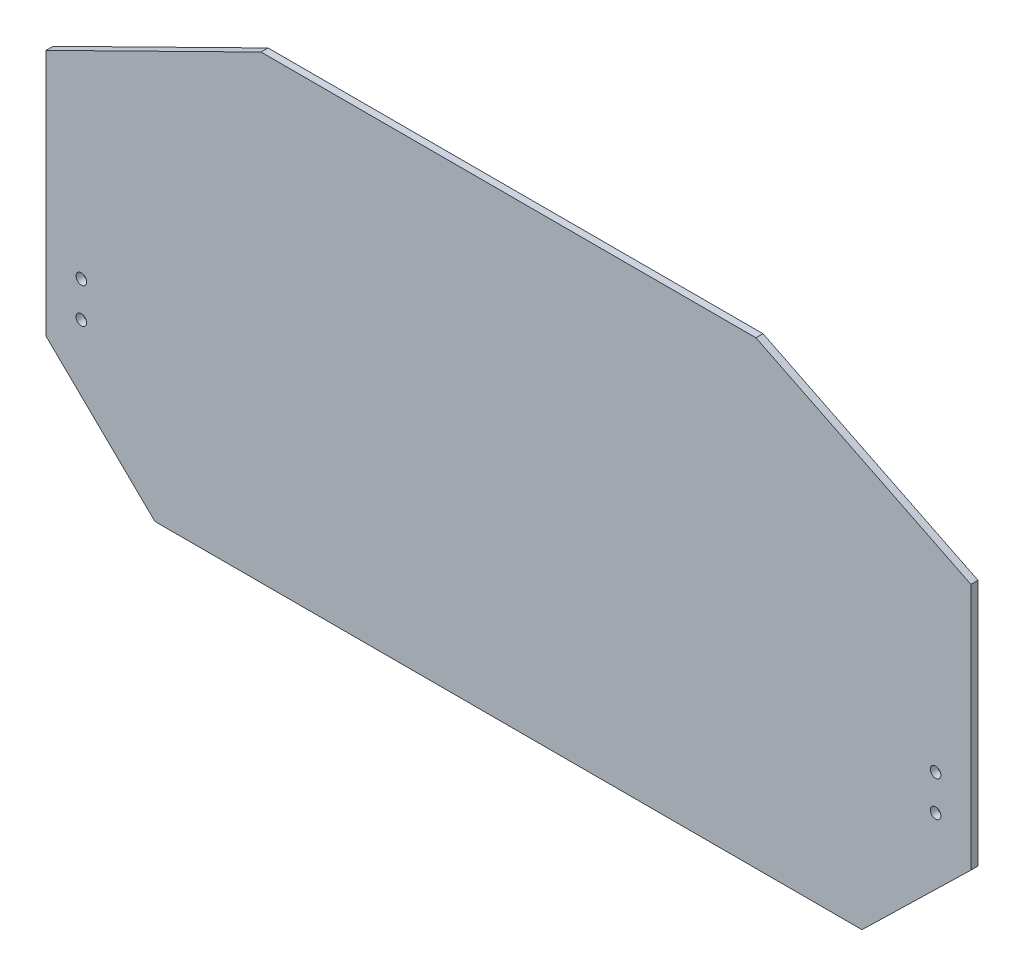
ISO-10303-21;
HEADER;
FILE_DESCRIPTION(('STEP AP214'),'2;1');
FILE_NAME('part.step','',(''),(''),'','','');
FILE_SCHEMA(('AUTOMOTIVE_DESIGN { 1 0 10303 214 1 1 1 1 }'));
ENDSEC;
DATA;
#1=APPLICATION_CONTEXT('core data for automotive mechanical design processes');
#2=APPLICATION_PROTOCOL_DEFINITION('international standard','automotive_design',2000,#1);
#3=PRODUCT_CONTEXT('',#1,'mechanical');
#4=PRODUCT('Part','Part','',(#3));
#5=PRODUCT_RELATED_PRODUCT_CATEGORY('part','',(#4));
#6=PRODUCT_DEFINITION_FORMATION('','',#4);
#7=PRODUCT_DEFINITION_CONTEXT('part definition',#1,'design');
#8=PRODUCT_DEFINITION('design','',#6,#7);
#9=PRODUCT_DEFINITION_SHAPE('','',#8);
#10=(LENGTH_UNIT() NAMED_UNIT(*) SI_UNIT(.MILLI.,.METRE.));
#11=(NAMED_UNIT(*) PLANE_ANGLE_UNIT() SI_UNIT($,.RADIAN.));
#12=(NAMED_UNIT(*) SI_UNIT($,.STERADIAN.) SOLID_ANGLE_UNIT());
#13=UNCERTAINTY_MEASURE_WITH_UNIT(LENGTH_MEASURE(1.E-05),#10,'distance_accuracy_value','');
#14=(GEOMETRIC_REPRESENTATION_CONTEXT(3) GLOBAL_UNCERTAINTY_ASSIGNED_CONTEXT((#13)) GLOBAL_UNIT_ASSIGNED_CONTEXT((#10,
#11,#12)) REPRESENTATION_CONTEXT('',''));
#15=CARTESIAN_POINT('',(0.,0.,0.));
#16=DIRECTION('',(0.,0.,1.));
#17=DIRECTION('',(1.,0.,0.));
#18=AXIS2_PLACEMENT_3D('',#15,#16,#17);
#19=CARTESIAN_POINT('',(0.,0.,2.));
#20=DIRECTION('',(0.,0.,-1.));
#21=DIRECTION('',(-1.,0.,0.));
#22=AXIS2_PLACEMENT_3D('',#19,#20,#21);
#23=PLANE('',#22);
#24=DIRECTION('',(0.716515814452554,-0.697570847756264,0.));
#25=VECTOR('',#24,1.);
#26=CARTESIAN_POINT('',(-130.814754519511,0.,2.));
#27=LINE('',#26,#25);
#28=CARTESIAN_POINT('',(-130.814754519511,0.,2.));
#29=VERTEX_POINT('',#28);
#30=CARTESIAN_POINT('',(-100.,-30.,2.));
#31=VERTEX_POINT('',#30);
#32=EDGE_CURVE('E153',#29,#31,#27,.T.);
#33=ORIENTED_EDGE('',*,*,#32,.T.);
#34=DIRECTION('',(1.,0.,0.));
#35=VECTOR('',#34,1.);
#36=CARTESIAN_POINT('',(-100.,-30.,2.));
#37=LINE('',#36,#35);
#38=CARTESIAN_POINT('',(100.,-30.,2.));
#39=VERTEX_POINT('',#38);
#40=EDGE_CURVE('E101',#31,#39,#37,.T.);
#41=ORIENTED_EDGE('',*,*,#40,.T.);
#42=DIRECTION('',(0.716515814452555,0.697570847756263,0.));
#43=VECTOR('',#42,1.);
#44=CARTESIAN_POINT('',(130.814754519511,0.,2.));
#45=LINE('',#44,#43);
#46=CARTESIAN_POINT('',(130.814754519511,0.,2.));
#47=VERTEX_POINT('',#46);
#48=EDGE_CURVE('E168',#39,#47,#45,.T.);
#49=ORIENTED_EDGE('',*,*,#48,.T.);
#50=DIRECTION('',(0.,1.,0.));
#51=VECTOR('',#50,1.);
#52=CARTESIAN_POINT('',(130.814754519511,0.,2.));
#53=LINE('',#52,#51);
#54=CARTESIAN_POINT('',(130.814754519511,70.,2.));
#55=VERTEX_POINT('',#54);
#56=EDGE_CURVE('E181',#47,#55,#53,.T.);
#57=ORIENTED_EDGE('',*,*,#56,.T.);
#58=DIRECTION('',(-0.896817268026416,0.442401161582601,0.));
#59=VECTOR('',#58,1.);
#60=CARTESIAN_POINT('',(130.814754519511,70.,2.));
#61=LINE('',#60,#59);
#62=CARTESIAN_POINT('',(70.,100.,2.));
#63=VERTEX_POINT('',#62);
#64=EDGE_CURVE('E120',#55,#63,#61,.T.);
#65=ORIENTED_EDGE('',*,*,#64,.T.);
#66=DIRECTION('',(-1.,0.,0.));
#67=VECTOR('',#66,1.);
#68=CARTESIAN_POINT('',(-70.,100.,2.));
#69=LINE('',#68,#67);
#70=CARTESIAN_POINT('',(-70.,100.,2.));
#71=VERTEX_POINT('',#70);
#72=EDGE_CURVE('E114',#63,#71,#69,.T.);
#73=ORIENTED_EDGE('',*,*,#72,.T.);
#74=DIRECTION('',(-0.896817268026416,-0.442401161582601,0.));
#75=VECTOR('',#74,1.);
#76=CARTESIAN_POINT('',(-130.814754519511,70.,2.));
#77=LINE('',#76,#75);
#78=CARTESIAN_POINT('',(-130.814754519511,70.,2.));
#79=VERTEX_POINT('',#78);
#80=EDGE_CURVE('E118',#71,#79,#77,.T.);
#81=ORIENTED_EDGE('',*,*,#80,.T.);
#82=DIRECTION('',(0.,-1.,0.));
#83=VECTOR('',#82,1.);
#84=CARTESIAN_POINT('',(-130.814754519511,0.,2.));
#85=LINE('',#84,#83);
#86=EDGE_CURVE('E58',#79,#29,#85,.T.);
#87=ORIENTED_EDGE('',*,*,#86,.T.);
#88=EDGE_LOOP('',(#33,#41,#49,#57,#65,#73,#81,#87));
#89=FACE_BOUND('',#88,.T.);
#90=CARTESIAN_POINT('',(-120.814754519511,9.,2.));
#91=DIRECTION('',(0.,0.,1.));
#92=DIRECTION('',(1.,0.,0.));
#93=AXIS2_PLACEMENT_3D('',#90,#91,#92);
#94=CIRCLE('',#93,1.5);
#95=CARTESIAN_POINT('',(-119.314754519511,9.,2.));
#96=VERTEX_POINT('',#95);
#97=EDGE_CURVE('E142',#96,#96,#94,.T.);
#98=ORIENTED_EDGE('',*,*,#97,.F.);
#99=EDGE_LOOP('',(#98));
#100=FACE_BOUND('',#99,.T.);
#101=CARTESIAN_POINT('',(-120.814754519511,19.,2.));
#102=DIRECTION('',(0.,0.,1.));
#103=DIRECTION('',(1.,0.,0.));
#104=AXIS2_PLACEMENT_3D('',#101,#102,#103);
#105=CIRCLE('',#104,1.5);
#106=CARTESIAN_POINT('',(-119.314754519511,19.,2.));
#107=VERTEX_POINT('',#106);
#108=EDGE_CURVE('E190',#107,#107,#105,.T.);
#109=ORIENTED_EDGE('',*,*,#108,.F.);
#110=EDGE_LOOP('',(#109));
#111=FACE_BOUND('',#110,.T.);
#112=CARTESIAN_POINT('',(120.814754519511,19.,2.));
#113=DIRECTION('',(0.,0.,1.));
#114=DIRECTION('',(-1.,0.,0.));
#115=AXIS2_PLACEMENT_3D('',#112,#113,#114);
#116=CIRCLE('',#115,1.5);
#117=CARTESIAN_POINT('',(119.314754519511,19.,2.));
#118=VERTEX_POINT('',#117);
#119=EDGE_CURVE('E196',#118,#118,#116,.T.);
#120=ORIENTED_EDGE('',*,*,#119,.F.);
#121=EDGE_LOOP('',(#120));
#122=FACE_BOUND('',#121,.T.);
#123=CARTESIAN_POINT('',(120.814754519511,9.,2.));
#124=DIRECTION('',(0.,0.,1.));
#125=DIRECTION('',(-1.,0.,0.));
#126=AXIS2_PLACEMENT_3D('',#123,#124,#125);
#127=CIRCLE('',#126,1.5);
#128=CARTESIAN_POINT('',(119.314754519511,9.,2.));
#129=VERTEX_POINT('',#128);
#130=EDGE_CURVE('E202',#129,#129,#127,.T.);
#131=ORIENTED_EDGE('',*,*,#130,.F.);
#132=EDGE_LOOP('',(#131));
#133=FACE_BOUND('',#132,.T.);
#134=ADVANCED_FACE('F41',(#89,#100,#111,#122,#133),#23,.F.);
#135=CARTESIAN_POINT('',(0.,0.,0.));
#136=DIRECTION('',(0.,0.,-1.));
#137=DIRECTION('',(-1.,0.,0.));
#138=AXIS2_PLACEMENT_3D('',#135,#136,#137);
#139=PLANE('',#138);
#140=CARTESIAN_POINT('',(120.814754519511,19.,0.));
#141=DIRECTION('',(0.,0.,1.));
#142=DIRECTION('',(-1.,0.,0.));
#143=AXIS2_PLACEMENT_3D('',#140,#141,#142);
#144=CIRCLE('',#143,1.5);
#145=CARTESIAN_POINT('',(119.314754519511,19.,0.));
#146=VERTEX_POINT('',#145);
#147=EDGE_CURVE('E199',#146,#146,#144,.T.);
#148=ORIENTED_EDGE('',*,*,#147,.T.);
#149=EDGE_LOOP('',(#148));
#150=FACE_BOUND('',#149,.T.);
#151=CARTESIAN_POINT('',(-120.814754519511,9.,0.));
#152=DIRECTION('',(0.,0.,1.));
#153=DIRECTION('',(1.,0.,0.));
#154=AXIS2_PLACEMENT_3D('',#151,#152,#153);
#155=CIRCLE('',#154,1.5);
#156=CARTESIAN_POINT('',(-119.314754519511,9.,0.));
#157=VERTEX_POINT('',#156);
#158=EDGE_CURVE('E187',#157,#157,#155,.T.);
#159=ORIENTED_EDGE('',*,*,#158,.T.);
#160=EDGE_LOOP('',(#159));
#161=FACE_BOUND('',#160,.T.);
#162=DIRECTION('',(0.716515814452554,-0.697570847756264,0.));
#163=VECTOR('',#162,1.);
#164=CARTESIAN_POINT('',(-130.814754519511,0.,0.));
#165=LINE('',#164,#163);
#166=CARTESIAN_POINT('',(-130.814754519511,0.,0.));
#167=VERTEX_POINT('',#166);
#168=CARTESIAN_POINT('',(-100.,-30.,0.));
#169=VERTEX_POINT('',#168);
#170=EDGE_CURVE('E138',#167,#169,#165,.T.);
#171=ORIENTED_EDGE('',*,*,#170,.F.);
#172=DIRECTION('',(0.,-1.,0.));
#173=VECTOR('',#172,1.);
#174=CARTESIAN_POINT('',(-130.814754519511,0.,0.));
#175=LINE('',#174,#173);
#176=CARTESIAN_POINT('',(-130.814754519511,70.,0.));
#177=VERTEX_POINT('',#176);
#178=EDGE_CURVE('E93',#177,#167,#175,.T.);
#179=ORIENTED_EDGE('',*,*,#178,.F.);
#180=DIRECTION('',(-0.896817268026416,-0.442401161582601,0.));
#181=VECTOR('',#180,1.);
#182=CARTESIAN_POINT('',(-130.814754519511,70.,0.));
#183=LINE('',#182,#181);
#184=CARTESIAN_POINT('',(-70.,100.,0.));
#185=VERTEX_POINT('',#184);
#186=EDGE_CURVE('E87',#185,#177,#183,.T.);
#187=ORIENTED_EDGE('',*,*,#186,.F.);
#188=DIRECTION('',(-1.,0.,0.));
#189=VECTOR('',#188,1.);
#190=CARTESIAN_POINT('',(-70.,100.,0.));
#191=LINE('',#190,#189);
#192=CARTESIAN_POINT('',(70.,100.,0.));
#193=VERTEX_POINT('',#192);
#194=EDGE_CURVE('E128',#193,#185,#191,.T.);
#195=ORIENTED_EDGE('',*,*,#194,.F.);
#196=DIRECTION('',(-0.896817268026416,0.442401161582601,0.));
#197=VECTOR('',#196,1.);
#198=CARTESIAN_POINT('',(130.814754519511,70.,0.));
#199=LINE('',#198,#197);
#200=CARTESIAN_POINT('',(130.814754519511,70.,0.));
#201=VERTEX_POINT('',#200);
#202=EDGE_CURVE('E148',#201,#193,#199,.T.);
#203=ORIENTED_EDGE('',*,*,#202,.F.);
#204=DIRECTION('',(0.,1.,0.));
#205=VECTOR('',#204,1.);
#206=CARTESIAN_POINT('',(130.814754519511,0.,0.));
#207=LINE('',#206,#205);
#208=CARTESIAN_POINT('',(130.814754519511,0.,0.));
#209=VERTEX_POINT('',#208);
#210=EDGE_CURVE('E146',#209,#201,#207,.T.);
#211=ORIENTED_EDGE('',*,*,#210,.F.);
#212=DIRECTION('',(0.716515814452555,0.697570847756263,0.));
#213=VECTOR('',#212,1.);
#214=CARTESIAN_POINT('',(130.814754519511,0.,0.));
#215=LINE('',#214,#213);
#216=CARTESIAN_POINT('',(100.,-30.,0.));
#217=VERTEX_POINT('',#216);
#218=EDGE_CURVE('E144',#217,#209,#215,.T.);
#219=ORIENTED_EDGE('',*,*,#218,.F.);
#220=DIRECTION('',(1.,0.,0.));
#221=VECTOR('',#220,1.);
#222=CARTESIAN_POINT('',(-100.,-30.,0.));
#223=LINE('',#222,#221);
#224=EDGE_CURVE('E141',#169,#217,#223,.T.);
#225=ORIENTED_EDGE('',*,*,#224,.F.);
#226=EDGE_LOOP('',(#171,#179,#187,#195,#203,#211,#219,#225));
#227=FACE_BOUND('',#226,.T.);
#228=CARTESIAN_POINT('',(-120.814754519511,19.,0.));
#229=DIRECTION('',(0.,0.,1.));
#230=DIRECTION('',(1.,0.,0.));
#231=AXIS2_PLACEMENT_3D('',#228,#229,#230);
#232=CIRCLE('',#231,1.5);
#233=CARTESIAN_POINT('',(-119.314754519511,19.,0.));
#234=VERTEX_POINT('',#233);
#235=EDGE_CURVE('E193',#234,#234,#232,.T.);
#236=ORIENTED_EDGE('',*,*,#235,.T.);
#237=EDGE_LOOP('',(#236));
#238=FACE_BOUND('',#237,.T.);
#239=CARTESIAN_POINT('',(120.814754519511,9.,0.));
#240=DIRECTION('',(0.,0.,1.));
#241=DIRECTION('',(-1.,0.,0.));
#242=AXIS2_PLACEMENT_3D('',#239,#240,#241);
#243=CIRCLE('',#242,1.5);
#244=CARTESIAN_POINT('',(119.314754519511,9.,0.));
#245=VERTEX_POINT('',#244);
#246=EDGE_CURVE('E205',#245,#245,#243,.T.);
#247=ORIENTED_EDGE('',*,*,#246,.T.);
#248=EDGE_LOOP('',(#247));
#249=FACE_BOUND('',#248,.T.);
#250=ADVANCED_FACE('F172',(#150,#161,#227,#238,#249),#139,.T.);
#251=CARTESIAN_POINT('',(-130.814754519511,0.,2.));
#252=DIRECTION('',(0.697570847756264,0.716515814452554,0.));
#253=DIRECTION('',(-0.716515814452554,0.697570847756264,0.));
#254=AXIS2_PLACEMENT_3D('',#251,#252,#253);
#255=PLANE('',#254);
#256=ORIENTED_EDGE('',*,*,#170,.T.);
#257=DIRECTION('',(0.,0.,-1.));
#258=VECTOR('',#257,1.);
#259=CARTESIAN_POINT('',(-100.,-30.,2.));
#260=LINE('',#259,#258);
#261=EDGE_CURVE('E11',#31,#169,#260,.T.);
#262=ORIENTED_EDGE('',*,*,#261,.F.);
#263=ORIENTED_EDGE('',*,*,#32,.F.);
#264=DIRECTION('',(0.,0.,-1.));
#265=VECTOR('',#264,1.);
#266=CARTESIAN_POINT('',(-130.814754519511,0.,2.));
#267=LINE('',#266,#265);
#268=EDGE_CURVE('E134',#29,#167,#267,.T.);
#269=ORIENTED_EDGE('',*,*,#268,.T.);
#270=EDGE_LOOP('',(#256,#262,#263,#269));
#271=FACE_BOUND('',#270,.T.);
#272=ADVANCED_FACE('F43',(#271),#255,.F.);
#273=CARTESIAN_POINT('',(-100.,-30.,2.));
#274=DIRECTION('',(0.,1.,0.));
#275=DIRECTION('',(0.,0.,1.));
#276=AXIS2_PLACEMENT_3D('',#273,#274,#275);
#277=PLANE('',#276);
#278=ORIENTED_EDGE('',*,*,#224,.T.);
#279=DIRECTION('',(0.,0.,-1.));
#280=VECTOR('',#279,1.);
#281=CARTESIAN_POINT('',(100.,-30.,2.));
#282=LINE('',#281,#280);
#283=EDGE_CURVE('E50',#39,#217,#282,.T.);
#284=ORIENTED_EDGE('',*,*,#283,.F.);
#285=ORIENTED_EDGE('',*,*,#40,.F.);
#286=ORIENTED_EDGE('',*,*,#261,.T.);
#287=EDGE_LOOP('',(#278,#284,#285,#286));
#288=FACE_BOUND('',#287,.T.);
#289=ADVANCED_FACE('F237',(#288),#277,.F.);
#290=CARTESIAN_POINT('',(130.814754519511,0.,2.));
#291=DIRECTION('',(-0.697570847756263,0.716515814452555,0.));
#292=DIRECTION('',(-0.716515814452555,-0.697570847756263,0.));
#293=AXIS2_PLACEMENT_3D('',#290,#291,#292);
#294=PLANE('',#293);
#295=ORIENTED_EDGE('',*,*,#218,.T.);
#296=DIRECTION('',(0.,0.,-1.));
#297=VECTOR('',#296,1.);
#298=CARTESIAN_POINT('',(130.814754519511,0.,2.));
#299=LINE('',#298,#297);
#300=EDGE_CURVE('E160',#47,#209,#299,.T.);
#301=ORIENTED_EDGE('',*,*,#300,.F.);
#302=ORIENTED_EDGE('',*,*,#48,.F.);
#303=ORIENTED_EDGE('',*,*,#283,.T.);
#304=EDGE_LOOP('',(#295,#301,#302,#303));
#305=FACE_BOUND('',#304,.T.);
#306=ADVANCED_FACE('F166',(#305),#294,.F.);
#307=CARTESIAN_POINT('',(130.814754519511,0.,2.));
#308=DIRECTION('',(-1.,0.,0.));
#309=DIRECTION('',(0.,0.,1.));
#310=AXIS2_PLACEMENT_3D('',#307,#308,#309);
#311=PLANE('',#310);
#312=ORIENTED_EDGE('',*,*,#210,.T.);
#313=DIRECTION('',(0.,0.,-1.));
#314=VECTOR('',#313,1.);
#315=CARTESIAN_POINT('',(130.814754519511,70.,2.));
#316=LINE('',#315,#314);
#317=EDGE_CURVE('E157',#55,#201,#316,.T.);
#318=ORIENTED_EDGE('',*,*,#317,.F.);
#319=ORIENTED_EDGE('',*,*,#56,.F.);
#320=ORIENTED_EDGE('',*,*,#300,.T.);
#321=EDGE_LOOP('',(#312,#318,#319,#320));
#322=FACE_BOUND('',#321,.T.);
#323=ADVANCED_FACE('F177',(#322),#311,.F.);
#324=CARTESIAN_POINT('',(130.814754519511,70.,2.));
#325=DIRECTION('',(-0.442401161582601,-0.896817268026417,0.));
#326=DIRECTION('',(0.896817268026417,-0.442401161582601,0.));
#327=AXIS2_PLACEMENT_3D('',#324,#325,#326);
#328=PLANE('',#327);
#329=ORIENTED_EDGE('',*,*,#202,.T.);
#330=DIRECTION('',(0.,0.,-1.));
#331=VECTOR('',#330,1.);
#332=CARTESIAN_POINT('',(70.,100.,2.));
#333=LINE('',#332,#331);
#334=EDGE_CURVE('E129',#63,#193,#333,.T.);
#335=ORIENTED_EDGE('',*,*,#334,.F.);
#336=ORIENTED_EDGE('',*,*,#64,.F.);
#337=ORIENTED_EDGE('',*,*,#317,.T.);
#338=EDGE_LOOP('',(#329,#335,#336,#337));
#339=FACE_BOUND('',#338,.T.);
#340=ADVANCED_FACE('F180',(#339),#328,.F.);
#341=CARTESIAN_POINT('',(-70.,100.,2.));
#342=DIRECTION('',(0.,-1.,0.));
#343=DIRECTION('',(0.,0.,-1.));
#344=AXIS2_PLACEMENT_3D('',#341,#342,#343);
#345=PLANE('',#344);
#346=ORIENTED_EDGE('',*,*,#194,.T.);
#347=DIRECTION('',(0.,0.,-1.));
#348=VECTOR('',#347,1.);
#349=CARTESIAN_POINT('',(-70.,100.,2.));
#350=LINE('',#349,#348);
#351=EDGE_CURVE('E125',#71,#185,#350,.T.);
#352=ORIENTED_EDGE('',*,*,#351,.F.);
#353=ORIENTED_EDGE('',*,*,#72,.F.);
#354=ORIENTED_EDGE('',*,*,#334,.T.);
#355=EDGE_LOOP('',(#346,#352,#353,#354));
#356=FACE_BOUND('',#355,.T.);
#357=ADVANCED_FACE('F126',(#356),#345,.F.);
#358=CARTESIAN_POINT('',(-130.814754519511,70.,2.));
#359=DIRECTION('',(0.442401161582601,-0.896817268026417,0.));
#360=DIRECTION('',(0.896817268026417,0.442401161582601,0.));
#361=AXIS2_PLACEMENT_3D('',#358,#359,#360);
#362=PLANE('',#361);
#363=ORIENTED_EDGE('',*,*,#186,.T.);
#364=DIRECTION('',(0.,0.,-1.));
#365=VECTOR('',#364,1.);
#366=CARTESIAN_POINT('',(-130.814754519511,70.,2.));
#367=LINE('',#366,#365);
#368=EDGE_CURVE('E130',#79,#177,#367,.T.);
#369=ORIENTED_EDGE('',*,*,#368,.F.);
#370=ORIENTED_EDGE('',*,*,#80,.F.);
#371=ORIENTED_EDGE('',*,*,#351,.T.);
#372=EDGE_LOOP('',(#363,#369,#370,#371));
#373=FACE_BOUND('',#372,.T.);
#374=ADVANCED_FACE('F132',(#373),#362,.F.);
#375=CARTESIAN_POINT('',(-130.814754519511,0.,2.));
#376=DIRECTION('',(1.,0.,0.));
#377=DIRECTION('',(0.,0.,-1.));
#378=AXIS2_PLACEMENT_3D('',#375,#376,#377);
#379=PLANE('',#378);
#380=ORIENTED_EDGE('',*,*,#178,.T.);
#381=ORIENTED_EDGE('',*,*,#268,.F.);
#382=ORIENTED_EDGE('',*,*,#86,.F.);
#383=ORIENTED_EDGE('',*,*,#368,.T.);
#384=EDGE_LOOP('',(#380,#381,#382,#383));
#385=FACE_BOUND('',#384,.T.);
#386=ADVANCED_FACE('F225',(#385),#379,.F.);
#387=CARTESIAN_POINT('',(-120.814754519511,9.,2.));
#388=DIRECTION('',(0.,0.,-1.));
#389=DIRECTION('',(-1.,0.,0.));
#390=AXIS2_PLACEMENT_3D('',#387,#388,#389);
#391=CYLINDRICAL_SURFACE('',#390,1.5);
#392=ORIENTED_EDGE('',*,*,#97,.T.);
#393=EDGE_LOOP('',(#392));
#394=FACE_BOUND('',#393,.T.);
#395=ORIENTED_EDGE('',*,*,#158,.F.);
#396=EDGE_LOOP('',(#395));
#397=FACE_BOUND('',#396,.T.);
#398=ADVANCED_FACE('F222',(#394,#397),#391,.F.);
#399=CARTESIAN_POINT('',(-120.814754519511,19.,2.));
#400=DIRECTION('',(0.,0.,-1.));
#401=DIRECTION('',(-1.,0.,0.));
#402=AXIS2_PLACEMENT_3D('',#399,#400,#401);
#403=CYLINDRICAL_SURFACE('',#402,1.5);
#404=ORIENTED_EDGE('',*,*,#108,.T.);
#405=EDGE_LOOP('',(#404));
#406=FACE_BOUND('',#405,.T.);
#407=ORIENTED_EDGE('',*,*,#235,.F.);
#408=EDGE_LOOP('',(#407));
#409=FACE_BOUND('',#408,.T.);
#410=ADVANCED_FACE('F300',(#406,#409),#403,.F.);
#411=CARTESIAN_POINT('',(120.814754519511,19.,2.));
#412=DIRECTION('',(0.,0.,-1.));
#413=DIRECTION('',(-1.,0.,0.));
#414=AXIS2_PLACEMENT_3D('',#411,#412,#413);
#415=CYLINDRICAL_SURFACE('',#414,1.5);
#416=ORIENTED_EDGE('',*,*,#119,.T.);
#417=EDGE_LOOP('',(#416));
#418=FACE_BOUND('',#417,.T.);
#419=ORIENTED_EDGE('',*,*,#147,.F.);
#420=EDGE_LOOP('',(#419));
#421=FACE_BOUND('',#420,.T.);
#422=ADVANCED_FACE('F308',(#418,#421),#415,.F.);
#423=CARTESIAN_POINT('',(120.814754519511,9.,2.));
#424=DIRECTION('',(0.,0.,-1.));
#425=DIRECTION('',(-1.,0.,0.));
#426=AXIS2_PLACEMENT_3D('',#423,#424,#425);
#427=CYLINDRICAL_SURFACE('',#426,1.5);
#428=ORIENTED_EDGE('',*,*,#130,.T.);
#429=EDGE_LOOP('',(#428));
#430=FACE_BOUND('',#429,.T.);
#431=ORIENTED_EDGE('',*,*,#246,.F.);
#432=EDGE_LOOP('',(#431));
#433=FACE_BOUND('',#432,.T.);
#434=ADVANCED_FACE('F211',(#430,#433),#427,.F.);
#435=CLOSED_SHELL('',(#134,#250,#272,#289,#306,#323,#340,#357,#374,#386,#398,#410,#422,#434));
#436=MANIFOLD_SOLID_BREP('B2',#435);
#437=ADVANCED_BREP_SHAPE_REPRESENTATION('',(#18,#436),#14);
#438=SHAPE_DEFINITION_REPRESENTATION(#9,#437);
ENDSEC;
END-ISO-10303-21;
